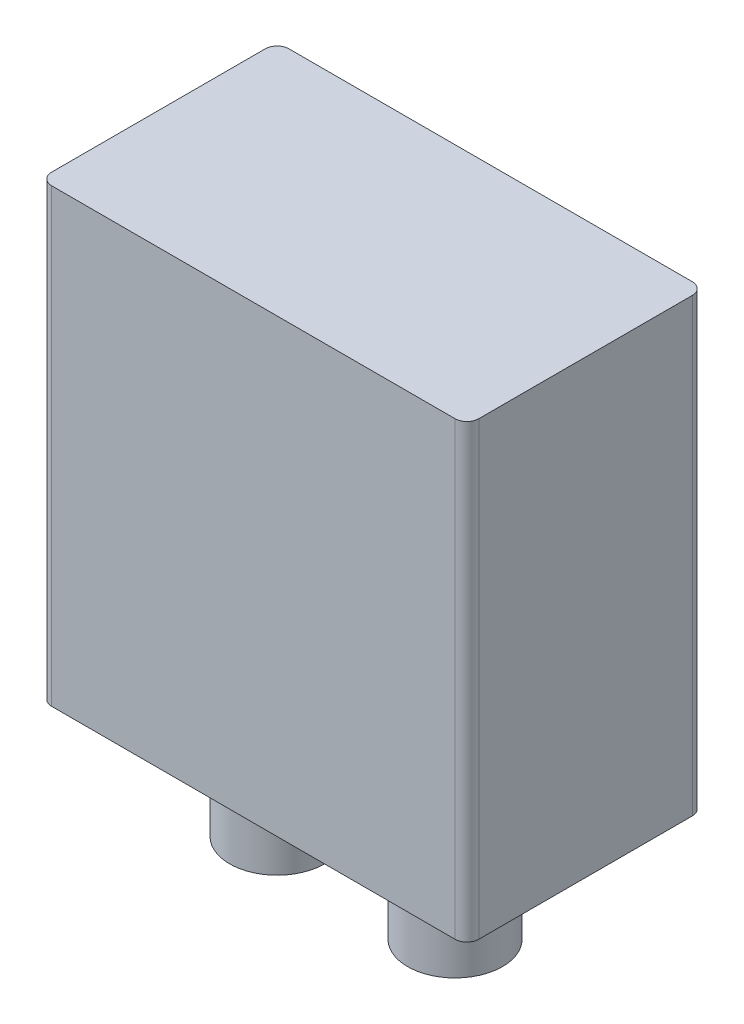
ISO-10303-21;
HEADER;
FILE_DESCRIPTION(('STEP AP214'),'2;1');
FILE_NAME('part.step','',(''),(''),'','','');
FILE_SCHEMA(('AUTOMOTIVE_DESIGN { 1 0 10303 214 1 1 1 1 }'));
ENDSEC;
DATA;
#1=APPLICATION_CONTEXT('core data for automotive mechanical design processes');
#2=APPLICATION_PROTOCOL_DEFINITION('international standard','automotive_design',2000,#1);
#3=PRODUCT_CONTEXT('',#1,'mechanical');
#4=PRODUCT('Part','Part','',(#3));
#5=PRODUCT_RELATED_PRODUCT_CATEGORY('part','',(#4));
#6=PRODUCT_DEFINITION_FORMATION('','',#4);
#7=PRODUCT_DEFINITION_CONTEXT('part definition',#1,'design');
#8=PRODUCT_DEFINITION('design','',#6,#7);
#9=PRODUCT_DEFINITION_SHAPE('','',#8);
#10=(LENGTH_UNIT() NAMED_UNIT(*) SI_UNIT(.MILLI.,.METRE.));
#11=(NAMED_UNIT(*) PLANE_ANGLE_UNIT() SI_UNIT($,.RADIAN.));
#12=(NAMED_UNIT(*) SI_UNIT($,.STERADIAN.) SOLID_ANGLE_UNIT());
#13=UNCERTAINTY_MEASURE_WITH_UNIT(LENGTH_MEASURE(1.E-05),#10,'distance_accuracy_value','');
#14=(GEOMETRIC_REPRESENTATION_CONTEXT(3) GLOBAL_UNCERTAINTY_ASSIGNED_CONTEXT((#13)) GLOBAL_UNIT_ASSIGNED_CONTEXT((#10,
#11,#12)) REPRESENTATION_CONTEXT('',''));
#15=CARTESIAN_POINT('',(0.,0.,0.));
#16=DIRECTION('',(0.,0.,1.));
#17=DIRECTION('',(1.,0.,0.));
#18=AXIS2_PLACEMENT_3D('',#15,#16,#17);
#19=CARTESIAN_POINT('',(7.,-29.,10.));
#20=DIRECTION('',(0.,1.,0.));
#21=DIRECTION('',(0.,0.,1.));
#22=AXIS2_PLACEMENT_3D('',#19,#20,#21);
#23=CYLINDRICAL_SURFACE('',#22,4.);
#24=CARTESIAN_POINT('',(7.,-29.,10.));
#25=DIRECTION('',(0.,-1.,0.));
#26=DIRECTION('',(0.,0.,-1.));
#27=AXIS2_PLACEMENT_3D('',#24,#25,#26);
#28=CIRCLE('',#27,4.);
#29=CARTESIAN_POINT('',(7.,-29.,6.));
#30=VERTEX_POINT('',#29);
#31=EDGE_CURVE('E11',#30,#30,#28,.T.);
#32=ORIENTED_EDGE('',*,*,#31,.F.);
#33=EDGE_LOOP('',(#32));
#34=FACE_BOUND('',#33,.T.);
#35=CARTESIAN_POINT('',(7.,-19.,10.));
#36=DIRECTION('',(0.,-1.,0.));
#37=DIRECTION('',(0.,0.,-1.));
#38=AXIS2_PLACEMENT_3D('',#35,#36,#37);
#39=CIRCLE('',#38,4.);
#40=CARTESIAN_POINT('',(7.,-19.,6.));
#41=VERTEX_POINT('',#40);
#42=EDGE_CURVE('E48',#41,#41,#39,.T.);
#43=ORIENTED_EDGE('',*,*,#42,.T.);
#44=EDGE_LOOP('',(#43));
#45=FACE_BOUND('',#44,.T.);
#46=ADVANCED_FACE('F45',(#34,#45),#23,.T.);
#47=CARTESIAN_POINT('',(7.,-29.,10.));
#48=DIRECTION('',(0.,-1.,0.));
#49=DIRECTION('',(0.,0.,-1.));
#50=AXIS2_PLACEMENT_3D('',#47,#48,#49);
#51=PLANE('',#50);
#52=ORIENTED_EDGE('',*,*,#31,.T.);
#53=EDGE_LOOP('',(#52));
#54=FACE_BOUND('',#53,.T.);
#55=ADVANCED_FACE('F60',(#54),#51,.T.);
#56=CARTESIAN_POINT('',(7.,-19.,10.));
#57=DIRECTION('',(0.,-1.,0.));
#58=DIRECTION('',(0.,0.,-1.));
#59=AXIS2_PLACEMENT_3D('',#56,#57,#58);
#60=PLANE('',#59);
#61=ORIENTED_EDGE('',*,*,#42,.F.);
#62=EDGE_LOOP('',(#61));
#63=FACE_BOUND('',#62,.T.);
#64=ADVANCED_FACE('F58',(#63),#60,.F.);
#65=CLOSED_SHELL('',(#46,#55,#64));
#66=MANIFOLD_SOLID_BREP('B2',#65);
#67=CARTESIAN_POINT('',(-8.,-29.,10.));
#68=DIRECTION('',(0.,1.,0.));
#69=DIRECTION('',(0.,0.,1.));
#70=AXIS2_PLACEMENT_3D('',#67,#68,#69);
#71=CYLINDRICAL_SURFACE('',#70,4.);
#72=CARTESIAN_POINT('',(-8.,-29.,10.));
#73=DIRECTION('',(0.,-1.,0.));
#74=DIRECTION('',(0.,0.,-1.));
#75=AXIS2_PLACEMENT_3D('',#72,#73,#74);
#76=CIRCLE('',#75,4.);
#77=CARTESIAN_POINT('',(-8.,-29.,6.));
#78=VERTEX_POINT('',#77);
#79=EDGE_CURVE('E44',#78,#78,#76,.T.);
#80=ORIENTED_EDGE('',*,*,#79,.F.);
#81=EDGE_LOOP('',(#80));
#82=FACE_BOUND('',#81,.T.);
#83=CARTESIAN_POINT('',(-8.,-19.,10.));
#84=DIRECTION('',(0.,-1.,0.));
#85=DIRECTION('',(0.,0.,-1.));
#86=AXIS2_PLACEMENT_3D('',#83,#84,#85);
#87=CIRCLE('',#86,4.);
#88=CARTESIAN_POINT('',(-8.,-19.,6.));
#89=VERTEX_POINT('',#88);
#90=EDGE_CURVE('E97',#89,#89,#87,.T.);
#91=ORIENTED_EDGE('',*,*,#90,.T.);
#92=EDGE_LOOP('',(#91));
#93=FACE_BOUND('',#92,.T.);
#94=ADVANCED_FACE('F94',(#82,#93),#71,.T.);
#95=CARTESIAN_POINT('',(-8.,-29.,10.));
#96=DIRECTION('',(0.,-1.,0.));
#97=DIRECTION('',(0.,0.,-1.));
#98=AXIS2_PLACEMENT_3D('',#95,#96,#97);
#99=PLANE('',#98);
#100=ORIENTED_EDGE('',*,*,#79,.T.);
#101=EDGE_LOOP('',(#100));
#102=FACE_BOUND('',#101,.T.);
#103=ADVANCED_FACE('F109',(#102),#99,.T.);
#104=CARTESIAN_POINT('',(-8.,-19.,10.));
#105=DIRECTION('',(0.,-1.,0.));
#106=DIRECTION('',(0.,0.,-1.));
#107=AXIS2_PLACEMENT_3D('',#104,#105,#106);
#108=PLANE('',#107);
#109=ORIENTED_EDGE('',*,*,#90,.F.);
#110=EDGE_LOOP('',(#109));
#111=FACE_BOUND('',#110,.T.);
#112=ADVANCED_FACE('F107',(#111),#108,.F.);
#113=CLOSED_SHELL('',(#94,#103,#112));
#114=MANIFOLD_SOLID_BREP('B6',#113);
#115=CARTESIAN_POINT('',(18.,-19.,20.));
#116=DIRECTION('',(-1.,0.,0.));
#117=DIRECTION('',(0.,0.,1.));
#118=AXIS2_PLACEMENT_3D('',#115,#116,#117);
#119=PLANE('',#118);
#120=DIRECTION('',(0.,0.,-1.));
#121=VECTOR('',#120,1.);
#122=CARTESIAN_POINT('',(18.,-19.,20.));
#123=LINE('',#122,#121);
#124=CARTESIAN_POINT('',(18.,-19.,19.));
#125=VERTEX_POINT('',#124);
#126=CARTESIAN_POINT('',(18.,-19.,1.));
#127=VERTEX_POINT('',#126);
#128=EDGE_CURVE('E263',#125,#127,#123,.T.);
#129=ORIENTED_EDGE('',*,*,#128,.T.);
#130=DIRECTION('',(0.,1.,0.));
#131=VECTOR('',#130,1.);
#132=CARTESIAN_POINT('',(18.,19.,1.));
#133=LINE('',#132,#131);
#134=CARTESIAN_POINT('',(18.,19.,1.));
#135=VERTEX_POINT('',#134);
#136=EDGE_CURVE('E219',#127,#135,#133,.T.);
#137=ORIENTED_EDGE('',*,*,#136,.T.);
#138=DIRECTION('',(0.,0.,-1.));
#139=VECTOR('',#138,1.);
#140=CARTESIAN_POINT('',(18.,19.,20.));
#141=LINE('',#140,#139);
#142=CARTESIAN_POINT('',(18.,19.,19.));
#143=VERTEX_POINT('',#142);
#144=EDGE_CURVE('E203',#143,#135,#141,.T.);
#145=ORIENTED_EDGE('',*,*,#144,.F.);
#146=DIRECTION('',(0.,1.,0.));
#147=VECTOR('',#146,1.);
#148=CARTESIAN_POINT('',(18.,-19.,19.));
#149=LINE('',#148,#147);
#150=EDGE_CURVE('E216',#143,#125,#149,.F.);
#151=ORIENTED_EDGE('',*,*,#150,.T.);
#152=EDGE_LOOP('',(#129,#137,#145,#151));
#153=FACE_BOUND('',#152,.T.);
#154=ADVANCED_FACE('F134',(#153),#119,.F.);
#155=CARTESIAN_POINT('',(-18.,19.,20.));
#156=DIRECTION('',(0.,-1.,0.));
#157=DIRECTION('',(0.,0.,-1.));
#158=AXIS2_PLACEMENT_3D('',#155,#156,#157);
#159=PLANE('',#158);
#160=ORIENTED_EDGE('',*,*,#144,.T.);
#161=CARTESIAN_POINT('',(17.,19.,1.));
#162=DIRECTION('',(0.,-1.,0.));
#163=DIRECTION('',(0.,0.,-1.));
#164=AXIS2_PLACEMENT_3D('',#161,#162,#163);
#165=CIRCLE('',#164,1.);
#166=CARTESIAN_POINT('',(17.,19.,0.));
#167=VERTEX_POINT('',#166);
#168=EDGE_CURVE('E210',#135,#167,#165,.F.);
#169=ORIENTED_EDGE('',*,*,#168,.T.);
#170=DIRECTION('',(-1.,0.,0.));
#171=VECTOR('',#170,1.);
#172=CARTESIAN_POINT('',(-18.,19.,0.));
#173=LINE('',#172,#171);
#174=CARTESIAN_POINT('',(-17.,19.,0.));
#175=VERTEX_POINT('',#174);
#176=EDGE_CURVE('E269',#167,#175,#173,.T.);
#177=ORIENTED_EDGE('',*,*,#176,.T.);
#178=CARTESIAN_POINT('',(-17.,19.,1.));
#179=DIRECTION('',(0.,-1.,0.));
#180=DIRECTION('',(0.,0.,-1.));
#181=AXIS2_PLACEMENT_3D('',#178,#179,#180);
#182=CIRCLE('',#181,1.);
#183=CARTESIAN_POINT('',(-18.,19.,1.));
#184=VERTEX_POINT('',#183);
#185=EDGE_CURVE('E211',#175,#184,#182,.F.);
#186=ORIENTED_EDGE('',*,*,#185,.T.);
#187=DIRECTION('',(0.,0.,-1.));
#188=VECTOR('',#187,1.);
#189=CARTESIAN_POINT('',(-18.,19.,20.));
#190=LINE('',#189,#188);
#191=CARTESIAN_POINT('',(-18.,19.,19.));
#192=VERTEX_POINT('',#191);
#193=EDGE_CURVE('E220',#192,#184,#190,.T.);
#194=ORIENTED_EDGE('',*,*,#193,.F.);
#195=CARTESIAN_POINT('',(-17.,19.,19.));
#196=DIRECTION('',(0.,-1.,0.));
#197=DIRECTION('',(0.,0.,-1.));
#198=AXIS2_PLACEMENT_3D('',#195,#196,#197);
#199=CIRCLE('',#198,1.);
#200=CARTESIAN_POINT('',(-17.,19.,20.));
#201=VERTEX_POINT('',#200);
#202=EDGE_CURVE('E226',#192,#201,#199,.F.);
#203=ORIENTED_EDGE('',*,*,#202,.T.);
#204=DIRECTION('',(-1.,0.,0.));
#205=VECTOR('',#204,1.);
#206=CARTESIAN_POINT('',(-18.,19.,20.));
#207=LINE('',#206,#205);
#208=CARTESIAN_POINT('',(17.,19.,20.));
#209=VERTEX_POINT('',#208);
#210=EDGE_CURVE('E205',#209,#201,#207,.T.);
#211=ORIENTED_EDGE('',*,*,#210,.F.);
#212=CARTESIAN_POINT('',(17.,19.,19.));
#213=DIRECTION('',(0.,-1.,0.));
#214=DIRECTION('',(0.,0.,-1.));
#215=AXIS2_PLACEMENT_3D('',#212,#213,#214);
#216=CIRCLE('',#215,1.);
#217=EDGE_CURVE('E200',#209,#143,#216,.F.);
#218=ORIENTED_EDGE('',*,*,#217,.T.);
#219=EDGE_LOOP('',(#160,#169,#177,#186,#194,#203,#211,#218));
#220=FACE_BOUND('',#219,.T.);
#221=ADVANCED_FACE('F202',(#220),#159,.F.);
#222=CARTESIAN_POINT('',(-18.,-19.,20.));
#223=DIRECTION('',(1.,0.,0.));
#224=DIRECTION('',(0.,0.,-1.));
#225=AXIS2_PLACEMENT_3D('',#222,#223,#224);
#226=PLANE('',#225);
#227=ORIENTED_EDGE('',*,*,#193,.T.);
#228=DIRECTION('',(0.,-1.,0.));
#229=VECTOR('',#228,1.);
#230=CARTESIAN_POINT('',(-18.,-19.,1.));
#231=LINE('',#230,#229);
#232=CARTESIAN_POINT('',(-18.,-19.,1.));
#233=VERTEX_POINT('',#232);
#234=EDGE_CURVE('E92',#184,#233,#231,.T.);
#235=ORIENTED_EDGE('',*,*,#234,.T.);
#236=DIRECTION('',(0.,0.,-1.));
#237=VECTOR('',#236,1.);
#238=CARTESIAN_POINT('',(-18.,-19.,20.));
#239=LINE('',#238,#237);
#240=CARTESIAN_POINT('',(-18.,-19.,19.));
#241=VERTEX_POINT('',#240);
#242=EDGE_CURVE('E251',#241,#233,#239,.T.);
#243=ORIENTED_EDGE('',*,*,#242,.F.);
#244=DIRECTION('',(0.,-1.,0.));
#245=VECTOR('',#244,1.);
#246=CARTESIAN_POINT('',(-18.,-19.,19.));
#247=LINE('',#246,#245);
#248=EDGE_CURVE('E142',#241,#192,#247,.F.);
#249=ORIENTED_EDGE('',*,*,#248,.T.);
#250=EDGE_LOOP('',(#227,#235,#243,#249));
#251=FACE_BOUND('',#250,.T.);
#252=ADVANCED_FACE('F250',(#251),#226,.F.);
#253=CARTESIAN_POINT('',(-18.,-19.,20.));
#254=DIRECTION('',(0.,1.,0.));
#255=DIRECTION('',(0.,0.,1.));
#256=AXIS2_PLACEMENT_3D('',#253,#254,#255);
#257=PLANE('',#256);
#258=DIRECTION('',(1.,0.,0.));
#259=VECTOR('',#258,1.);
#260=CARTESIAN_POINT('',(-18.,-19.,0.));
#261=LINE('',#260,#259);
#262=CARTESIAN_POINT('',(-17.,-19.,0.));
#263=VERTEX_POINT('',#262);
#264=CARTESIAN_POINT('',(17.,-19.,0.));
#265=VERTEX_POINT('',#264);
#266=EDGE_CURVE('E266',#263,#265,#261,.T.);
#267=ORIENTED_EDGE('',*,*,#266,.T.);
#268=CARTESIAN_POINT('',(17.,-19.,1.));
#269=DIRECTION('',(0.,1.,0.));
#270=DIRECTION('',(0.,0.,1.));
#271=AXIS2_PLACEMENT_3D('',#268,#269,#270);
#272=CIRCLE('',#271,1.);
#273=EDGE_CURVE('E240',#265,#127,#272,.F.);
#274=ORIENTED_EDGE('',*,*,#273,.T.);
#275=ORIENTED_EDGE('',*,*,#128,.F.);
#276=CARTESIAN_POINT('',(17.,-19.,19.));
#277=DIRECTION('',(0.,1.,0.));
#278=DIRECTION('',(0.,0.,1.));
#279=AXIS2_PLACEMENT_3D('',#276,#277,#278);
#280=CIRCLE('',#279,1.);
#281=CARTESIAN_POINT('',(17.,-19.,20.));
#282=VERTEX_POINT('',#281);
#283=EDGE_CURVE('E224',#125,#282,#280,.F.);
#284=ORIENTED_EDGE('',*,*,#283,.T.);
#285=DIRECTION('',(1.,0.,0.));
#286=VECTOR('',#285,1.);
#287=CARTESIAN_POINT('',(-18.,-19.,20.));
#288=LINE('',#287,#286);
#289=CARTESIAN_POINT('',(-17.,-19.,20.));
#290=VERTEX_POINT('',#289);
#291=EDGE_CURVE('E260',#290,#282,#288,.T.);
#292=ORIENTED_EDGE('',*,*,#291,.F.);
#293=CARTESIAN_POINT('',(-17.,-19.,19.));
#294=DIRECTION('',(0.,1.,0.));
#295=DIRECTION('',(0.,0.,1.));
#296=AXIS2_PLACEMENT_3D('',#293,#294,#295);
#297=CIRCLE('',#296,1.);
#298=EDGE_CURVE('E156',#290,#241,#297,.F.);
#299=ORIENTED_EDGE('',*,*,#298,.T.);
#300=ORIENTED_EDGE('',*,*,#242,.T.);
#301=CARTESIAN_POINT('',(-17.,-19.,1.));
#302=DIRECTION('',(0.,1.,0.));
#303=DIRECTION('',(0.,0.,1.));
#304=AXIS2_PLACEMENT_3D('',#301,#302,#303);
#305=CIRCLE('',#304,1.);
#306=EDGE_CURVE('E149',#233,#263,#305,.F.);
#307=ORIENTED_EDGE('',*,*,#306,.T.);
#308=EDGE_LOOP('',(#267,#274,#275,#284,#292,#299,#300,#307));
#309=FACE_BOUND('',#308,.T.);
#310=ADVANCED_FACE('F262',(#309),#257,.F.);
#311=CARTESIAN_POINT('',(0.,0.,20.));
#312=DIRECTION('',(0.,0.,-1.));
#313=DIRECTION('',(-1.,0.,0.));
#314=AXIS2_PLACEMENT_3D('',#311,#312,#313);
#315=PLANE('',#314);
#316=ORIENTED_EDGE('',*,*,#291,.T.);
#317=DIRECTION('',(0.,1.,0.));
#318=VECTOR('',#317,1.);
#319=CARTESIAN_POINT('',(17.,0.,20.));
#320=LINE('',#319,#318);
#321=EDGE_CURVE('E245',#282,#209,#320,.T.);
#322=ORIENTED_EDGE('',*,*,#321,.T.);
#323=ORIENTED_EDGE('',*,*,#210,.T.);
#324=DIRECTION('',(0.,-1.,0.));
#325=VECTOR('',#324,1.);
#326=CARTESIAN_POINT('',(-17.,0.,20.));
#327=LINE('',#326,#325);
#328=EDGE_CURVE('E242',#201,#290,#327,.T.);
#329=ORIENTED_EDGE('',*,*,#328,.T.);
#330=EDGE_LOOP('',(#316,#322,#323,#329));
#331=FACE_BOUND('',#330,.T.);
#332=ADVANCED_FACE('F259',(#331),#315,.F.);
#333=CARTESIAN_POINT('',(0.,0.,0.));
#334=DIRECTION('',(0.,0.,-1.));
#335=DIRECTION('',(-1.,0.,0.));
#336=AXIS2_PLACEMENT_3D('',#333,#334,#335);
#337=PLANE('',#336);
#338=ORIENTED_EDGE('',*,*,#176,.F.);
#339=DIRECTION('',(0.,1.,0.));
#340=VECTOR('',#339,1.);
#341=CARTESIAN_POINT('',(17.,-19.,0.));
#342=LINE('',#341,#340);
#343=EDGE_CURVE('E235',#167,#265,#342,.F.);
#344=ORIENTED_EDGE('',*,*,#343,.T.);
#345=ORIENTED_EDGE('',*,*,#266,.F.);
#346=DIRECTION('',(0.,-1.,0.));
#347=VECTOR('',#346,1.);
#348=CARTESIAN_POINT('',(-17.,19.,0.));
#349=LINE('',#348,#347);
#350=EDGE_CURVE('E233',#263,#175,#349,.F.);
#351=ORIENTED_EDGE('',*,*,#350,.T.);
#352=EDGE_LOOP('',(#338,#344,#345,#351));
#353=FACE_BOUND('',#352,.T.);
#354=ADVANCED_FACE('F276',(#353),#337,.T.);
#355=CARTESIAN_POINT('',(17.,-19.,1.));
#356=DIRECTION('',(0.,-1.,0.));
#357=DIRECTION('',(0.,0.,-1.));
#358=AXIS2_PLACEMENT_3D('',#355,#356,#357);
#359=CYLINDRICAL_SURFACE('',#358,1.);
#360=ORIENTED_EDGE('',*,*,#273,.F.);
#361=ORIENTED_EDGE('',*,*,#343,.F.);
#362=ORIENTED_EDGE('',*,*,#168,.F.);
#363=ORIENTED_EDGE('',*,*,#136,.F.);
#364=EDGE_LOOP('',(#360,#361,#362,#363));
#365=FACE_BOUND('',#364,.T.);
#366=ADVANCED_FACE('F284',(#365),#359,.T.);
#367=CARTESIAN_POINT('',(17.,0.,19.));
#368=DIRECTION('',(0.,1.,0.));
#369=DIRECTION('',(0.,0.,1.));
#370=AXIS2_PLACEMENT_3D('',#367,#368,#369);
#371=CYLINDRICAL_SURFACE('',#370,1.);
#372=ORIENTED_EDGE('',*,*,#283,.F.);
#373=ORIENTED_EDGE('',*,*,#150,.F.);
#374=ORIENTED_EDGE('',*,*,#217,.F.);
#375=ORIENTED_EDGE('',*,*,#321,.F.);
#376=EDGE_LOOP('',(#372,#373,#374,#375));
#377=FACE_BOUND('',#376,.T.);
#378=ADVANCED_FACE('F223',(#377),#371,.T.);
#379=CARTESIAN_POINT('',(-17.,-19.,1.));
#380=DIRECTION('',(0.,1.,0.));
#381=DIRECTION('',(0.,0.,1.));
#382=AXIS2_PLACEMENT_3D('',#379,#380,#381);
#383=CYLINDRICAL_SURFACE('',#382,1.);
#384=ORIENTED_EDGE('',*,*,#185,.F.);
#385=ORIENTED_EDGE('',*,*,#350,.F.);
#386=ORIENTED_EDGE('',*,*,#306,.F.);
#387=ORIENTED_EDGE('',*,*,#234,.F.);
#388=EDGE_LOOP('',(#384,#385,#386,#387));
#389=FACE_BOUND('',#388,.T.);
#390=ADVANCED_FACE('F278',(#389),#383,.T.);
#391=CARTESIAN_POINT('',(-17.,0.,19.));
#392=DIRECTION('',(0.,-1.,0.));
#393=DIRECTION('',(0.,0.,-1.));
#394=AXIS2_PLACEMENT_3D('',#391,#392,#393);
#395=CYLINDRICAL_SURFACE('',#394,1.);
#396=ORIENTED_EDGE('',*,*,#202,.F.);
#397=ORIENTED_EDGE('',*,*,#248,.F.);
#398=ORIENTED_EDGE('',*,*,#298,.F.);
#399=ORIENTED_EDGE('',*,*,#328,.F.);
#400=EDGE_LOOP('',(#396,#397,#398,#399));
#401=FACE_BOUND('',#400,.T.);
#402=ADVANCED_FACE('F136',(#401),#395,.T.);
#403=CLOSED_SHELL('',(#154,#221,#252,#310,#332,#354,#366,#378,#390,#402));
#404=MANIFOLD_SOLID_BREP('B39',#403);
#405=ADVANCED_BREP_SHAPE_REPRESENTATION('',(#18,#66,#114,#404),#14);
#406=SHAPE_DEFINITION_REPRESENTATION(#9,#405);
ENDSEC;
END-ISO-10303-21;
